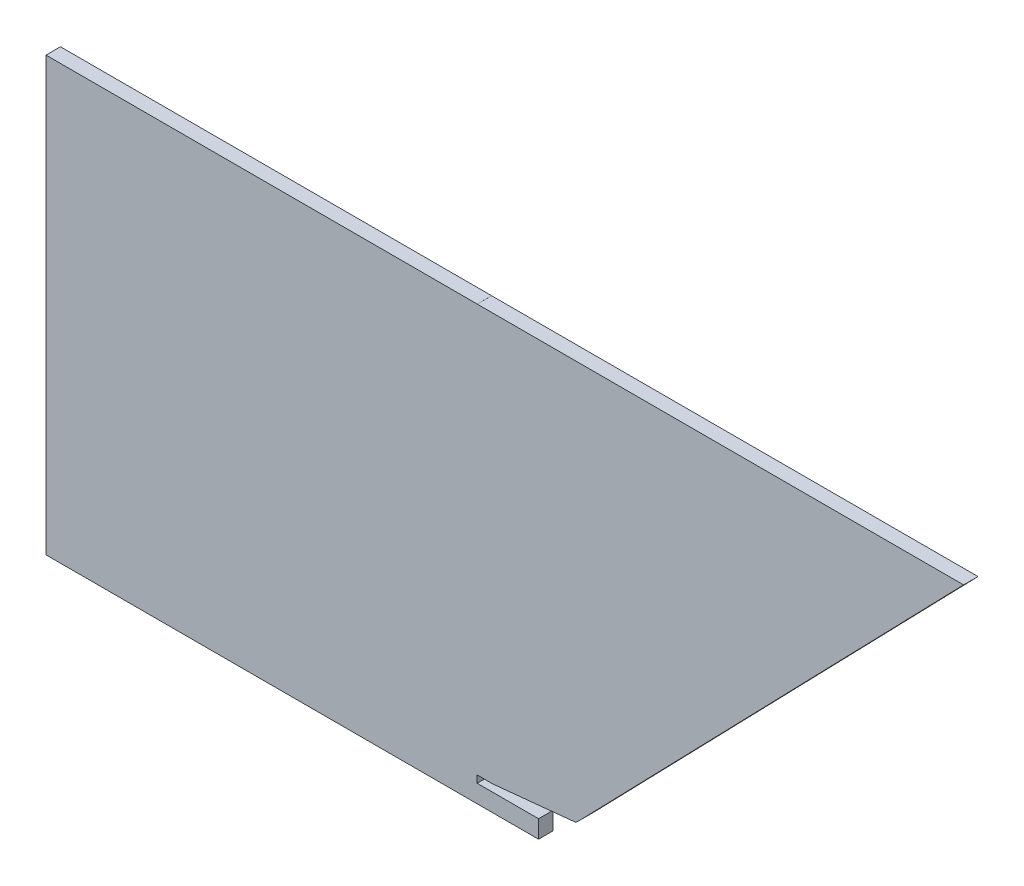
ISO-10303-21;
HEADER;
FILE_DESCRIPTION(('STEP AP214'),'2;1');
FILE_NAME('part.step','',(''),(''),'','','');
FILE_SCHEMA(('AUTOMOTIVE_DESIGN { 1 0 10303 214 1 1 1 1 }'));
ENDSEC;
DATA;
#1=APPLICATION_CONTEXT('core data for automotive mechanical design processes');
#2=APPLICATION_PROTOCOL_DEFINITION('international standard','automotive_design',2000,#1);
#3=PRODUCT_CONTEXT('',#1,'mechanical');
#4=PRODUCT('Part','Part','',(#3));
#5=PRODUCT_RELATED_PRODUCT_CATEGORY('part','',(#4));
#6=PRODUCT_DEFINITION_FORMATION('','',#4);
#7=PRODUCT_DEFINITION_CONTEXT('part definition',#1,'design');
#8=PRODUCT_DEFINITION('design','',#6,#7);
#9=PRODUCT_DEFINITION_SHAPE('','',#8);
#10=(LENGTH_UNIT() NAMED_UNIT(*) SI_UNIT(.MILLI.,.METRE.));
#11=(NAMED_UNIT(*) PLANE_ANGLE_UNIT() SI_UNIT($,.RADIAN.));
#12=(NAMED_UNIT(*) SI_UNIT($,.STERADIAN.) SOLID_ANGLE_UNIT());
#13=UNCERTAINTY_MEASURE_WITH_UNIT(LENGTH_MEASURE(1.E-05),#10,'distance_accuracy_value','');
#14=(GEOMETRIC_REPRESENTATION_CONTEXT(3) GLOBAL_UNCERTAINTY_ASSIGNED_CONTEXT((#13)) GLOBAL_UNIT_ASSIGNED_CONTEXT((#10,
#11,#12)) REPRESENTATION_CONTEXT('',''));
#15=CARTESIAN_POINT('',(0.,0.,0.));
#16=DIRECTION('',(0.,0.,1.));
#17=DIRECTION('',(1.,0.,0.));
#18=AXIS2_PLACEMENT_3D('',#15,#16,#17);
#19=CARTESIAN_POINT('',(0.,29.9956189480923,1.));
#20=DIRECTION('',(0.,-1.,0.));
#21=DIRECTION('',(-1.,0.,0.));
#22=AXIS2_PLACEMENT_3D('',#19,#20,#21);
#23=PLANE('',#22);
#24=DIRECTION('',(-1.,0.,0.));
#25=VECTOR('',#24,1.);
#26=CARTESIAN_POINT('',(0.,29.9956189480923,1.));
#27=LINE('',#26,#25);
#28=CARTESIAN_POINT('',(90.4166488621757,29.9956189480923,0.999999999999994));
#29=VERTEX_POINT('',#28);
#30=CARTESIAN_POINT('',(22.9944465005349,29.9956189480923,1.));
#31=VERTEX_POINT('',#30);
#32=EDGE_CURVE('E215',#29,#31,#27,.T.);
#33=ORIENTED_EDGE('',*,*,#32,.F.);
#34=DIRECTION('',(0.,0.,1.));
#35=VECTOR('',#34,1.);
#36=CARTESIAN_POINT('',(90.4166488621757,29.9956189480923,0.999999999999994));
#37=LINE('',#36,#35);
#38=CARTESIAN_POINT('',(90.4166488621757,29.9956189480923,-0.99999999999999));
#39=VERTEX_POINT('',#38);
#40=EDGE_CURVE('E195',#39,#29,#37,.T.);
#41=ORIENTED_EDGE('',*,*,#40,.F.);
#42=DIRECTION('',(-1.,0.,0.));
#43=VECTOR('',#42,1.);
#44=CARTESIAN_POINT('',(0.,29.9956189480923,-1.));
#45=LINE('',#44,#43);
#46=CARTESIAN_POINT('',(22.9944465005349,29.9956189480923,-1.));
#47=VERTEX_POINT('',#46);
#48=EDGE_CURVE('E241',#39,#47,#45,.T.);
#49=ORIENTED_EDGE('',*,*,#48,.T.);
#50=DIRECTION('',(0.,0.,1.));
#51=VECTOR('',#50,1.);
#52=CARTESIAN_POINT('',(22.9944465005349,29.9956189480923,1.));
#53=LINE('',#52,#51);
#54=EDGE_CURVE('E63',#47,#31,#53,.T.);
#55=ORIENTED_EDGE('',*,*,#54,.T.);
#56=EDGE_LOOP('',(#33,#41,#49,#55));
#57=FACE_BOUND('',#56,.T.);
#58=ADVANCED_FACE('F53',(#57),#23,.F.);
#59=CARTESIAN_POINT('',(22.9944465005349,0.,1.));
#60=DIRECTION('',(-1.,0.,0.));
#61=DIRECTION('',(0.,1.,0.));
#62=AXIS2_PLACEMENT_3D('',#59,#60,#61);
#63=PLANE('',#62);
#64=ORIENTED_EDGE('',*,*,#54,.F.);
#65=DIRECTION('',(0.,1.,0.));
#66=VECTOR('',#65,1.);
#67=CARTESIAN_POINT('',(22.9944465005349,0.,-1.));
#68=LINE('',#67,#66);
#69=CARTESIAN_POINT('',(22.9944465005349,30.,-1.));
#70=VERTEX_POINT('',#69);
#71=EDGE_CURVE('E205',#47,#70,#68,.T.);
#72=ORIENTED_EDGE('',*,*,#71,.T.);
#73=DIRECTION('',(0.,0.,1.));
#74=VECTOR('',#73,1.);
#75=CARTESIAN_POINT('',(22.9944465005349,30.,1.));
#76=LINE('',#75,#74);
#77=CARTESIAN_POINT('',(22.9944465005349,30.,1.));
#78=VERTEX_POINT('',#77);
#79=EDGE_CURVE('E262',#70,#78,#76,.T.);
#80=ORIENTED_EDGE('',*,*,#79,.T.);
#81=DIRECTION('',(0.,1.,0.));
#82=VECTOR('',#81,1.);
#83=CARTESIAN_POINT('',(22.9944465005349,0.,1.));
#84=LINE('',#83,#82);
#85=EDGE_CURVE('E151',#31,#78,#84,.T.);
#86=ORIENTED_EDGE('',*,*,#85,.F.);
#87=EDGE_LOOP('',(#64,#72,#80,#86));
#88=FACE_BOUND('',#87,.T.);
#89=ADVANCED_FACE('F290',(#88),#63,.F.);
#90=CARTESIAN_POINT('',(-31.5,30.,1.));
#91=DIRECTION('',(0.,-1.,0.));
#92=DIRECTION('',(-1.,0.,0.));
#93=AXIS2_PLACEMENT_3D('',#90,#91,#92);
#94=PLANE('',#93);
#95=ORIENTED_EDGE('',*,*,#79,.F.);
#96=DIRECTION('',(-1.,0.,0.));
#97=VECTOR('',#96,1.);
#98=CARTESIAN_POINT('',(0.,30.,-1.));
#99=LINE('',#98,#97);
#100=CARTESIAN_POINT('',(-36.7787595947439,30.,-1.));
#101=VERTEX_POINT('',#100);
#102=EDGE_CURVE('E161',#70,#101,#99,.T.);
#103=ORIENTED_EDGE('',*,*,#102,.T.);
#104=DIRECTION('',(0.,0.,1.));
#105=VECTOR('',#104,1.);
#106=CARTESIAN_POINT('',(-36.7787595947439,30.,0.));
#107=LINE('',#106,#105);
#108=CARTESIAN_POINT('',(-36.7787595947439,30.,1.));
#109=VERTEX_POINT('',#108);
#110=EDGE_CURVE('E158',#101,#109,#107,.T.);
#111=ORIENTED_EDGE('',*,*,#110,.T.);
#112=DIRECTION('',(-1.,0.,0.));
#113=VECTOR('',#112,1.);
#114=CARTESIAN_POINT('',(-31.5,30.,1.));
#115=LINE('',#114,#113);
#116=EDGE_CURVE('E145',#78,#109,#115,.T.);
#117=ORIENTED_EDGE('',*,*,#116,.F.);
#118=EDGE_LOOP('',(#95,#103,#111,#117));
#119=FACE_BOUND('',#118,.T.);
#120=ADVANCED_FACE('F159',(#119),#94,.F.);
#121=CARTESIAN_POINT('',(-31.5,-30.,1.));
#122=DIRECTION('',(0.,1.,0.));
#123=DIRECTION('',(1.,0.,0.));
#124=AXIS2_PLACEMENT_3D('',#121,#122,#123);
#125=PLANE('',#124);
#126=DIRECTION('',(0.,0.,1.));
#127=VECTOR('',#126,1.);
#128=CARTESIAN_POINT('',(31.5,-30.,1.));
#129=LINE('',#128,#127);
#130=CARTESIAN_POINT('',(31.5,-30.,-1.));
#131=VERTEX_POINT('',#130);
#132=CARTESIAN_POINT('',(31.5,-30.,1.));
#133=VERTEX_POINT('',#132);
#134=EDGE_CURVE('E258',#131,#133,#129,.T.);
#135=ORIENTED_EDGE('',*,*,#134,.T.);
#136=DIRECTION('',(1.,0.,0.));
#137=VECTOR('',#136,1.);
#138=CARTESIAN_POINT('',(-31.5,-30.,1.));
#139=LINE('',#138,#137);
#140=CARTESIAN_POINT('',(-36.7787595947439,-30.,1.));
#141=VERTEX_POINT('',#140);
#142=EDGE_CURVE('E154',#141,#133,#139,.T.);
#143=ORIENTED_EDGE('',*,*,#142,.F.);
#144=DIRECTION('',(0.,0.,1.));
#145=VECTOR('',#144,1.);
#146=CARTESIAN_POINT('',(-36.7787595947439,-30.,0.));
#147=LINE('',#146,#145);
#148=CARTESIAN_POINT('',(-36.7787595947439,-30.,-1.));
#149=VERTEX_POINT('',#148);
#150=EDGE_CURVE('E166',#149,#141,#147,.T.);
#151=ORIENTED_EDGE('',*,*,#150,.F.);
#152=DIRECTION('',(-1.,0.,0.));
#153=VECTOR('',#152,1.);
#154=CARTESIAN_POINT('',(0.,-30.,-1.));
#155=LINE('',#154,#153);
#156=EDGE_CURVE('E228',#149,#131,#155,.F.);
#157=ORIENTED_EDGE('',*,*,#156,.T.);
#158=EDGE_LOOP('',(#135,#143,#151,#157));
#159=FACE_BOUND('',#158,.T.);
#160=ADVANCED_FACE('F295',(#159),#125,.F.);
#161=CARTESIAN_POINT('',(31.5,-30.,1.));
#162=DIRECTION('',(-1.,0.,0.));
#163=DIRECTION('',(0.,1.,0.));
#164=AXIS2_PLACEMENT_3D('',#161,#162,#163);
#165=PLANE('',#164);
#166=ORIENTED_EDGE('',*,*,#134,.F.);
#167=DIRECTION('',(0.,1.,0.));
#168=VECTOR('',#167,1.);
#169=CARTESIAN_POINT('',(31.5,0.,-1.));
#170=LINE('',#169,#168);
#171=CARTESIAN_POINT('',(31.5,-27.5343810519077,-1.));
#172=VERTEX_POINT('',#171);
#173=EDGE_CURVE('E229',#131,#172,#170,.T.);
#174=ORIENTED_EDGE('',*,*,#173,.T.);
#175=DIRECTION('',(0.,0.,1.));
#176=VECTOR('',#175,1.);
#177=CARTESIAN_POINT('',(31.5,-27.5343810519077,1.));
#178=LINE('',#177,#176);
#179=CARTESIAN_POINT('',(31.5,-27.5343810519077,1.));
#180=VERTEX_POINT('',#179);
#181=EDGE_CURVE('E255',#172,#180,#178,.T.);
#182=ORIENTED_EDGE('',*,*,#181,.T.);
#183=DIRECTION('',(0.,1.,0.));
#184=VECTOR('',#183,1.);
#185=CARTESIAN_POINT('',(31.5,-30.,1.));
#186=LINE('',#185,#184);
#187=EDGE_CURVE('E155',#133,#180,#186,.T.);
#188=ORIENTED_EDGE('',*,*,#187,.F.);
#189=EDGE_LOOP('',(#166,#174,#182,#188));
#190=FACE_BOUND('',#189,.T.);
#191=ADVANCED_FACE('F307',(#190),#165,.F.);
#192=CARTESIAN_POINT('',(0.,-27.5343810519077,1.));
#193=DIRECTION('',(0.,-1.,0.));
#194=DIRECTION('',(-1.,0.,0.));
#195=AXIS2_PLACEMENT_3D('',#192,#193,#194);
#196=PLANE('',#195);
#197=DIRECTION('',(0.,0.,1.));
#198=VECTOR('',#197,1.);
#199=CARTESIAN_POINT('',(22.9944465005349,-27.5343810519077,1.));
#200=LINE('',#199,#198);
#201=CARTESIAN_POINT('',(22.9944465005349,-27.5343810519077,-1.));
#202=VERTEX_POINT('',#201);
#203=CARTESIAN_POINT('',(22.9944465005349,-27.5343810519077,1.));
#204=VERTEX_POINT('',#203);
#205=EDGE_CURVE('E251',#202,#204,#200,.T.);
#206=ORIENTED_EDGE('',*,*,#205,.T.);
#207=DIRECTION('',(-1.,0.,0.));
#208=VECTOR('',#207,1.);
#209=CARTESIAN_POINT('',(0.,-27.5343810519077,1.));
#210=LINE('',#209,#208);
#211=EDGE_CURVE('E209',#180,#204,#210,.T.);
#212=ORIENTED_EDGE('',*,*,#211,.F.);
#213=ORIENTED_EDGE('',*,*,#181,.F.);
#214=DIRECTION('',(-1.,0.,0.));
#215=VECTOR('',#214,1.);
#216=CARTESIAN_POINT('',(0.,-27.5343810519077,-1.));
#217=LINE('',#216,#215);
#218=EDGE_CURVE('E225',#172,#202,#217,.T.);
#219=ORIENTED_EDGE('',*,*,#218,.T.);
#220=EDGE_LOOP('',(#206,#212,#213,#219));
#221=FACE_BOUND('',#220,.T.);
#222=ADVANCED_FACE('F300',(#221),#196,.F.);
#223=CARTESIAN_POINT('',(22.9944465005349,0.,1.));
#224=DIRECTION('',(-1.,0.,0.));
#225=DIRECTION('',(0.,1.,0.));
#226=AXIS2_PLACEMENT_3D('',#223,#224,#225);
#227=PLANE('',#226);
#228=ORIENTED_EDGE('',*,*,#205,.F.);
#229=DIRECTION('',(0.,1.,0.));
#230=VECTOR('',#229,1.);
#231=CARTESIAN_POINT('',(22.9944465005349,0.,-1.));
#232=LINE('',#231,#230);
#233=CARTESIAN_POINT('',(22.9944465005349,-26.5343810519077,-1.));
#234=VERTEX_POINT('',#233);
#235=EDGE_CURVE('E221',#202,#234,#232,.T.);
#236=ORIENTED_EDGE('',*,*,#235,.T.);
#237=DIRECTION('',(0.,0.,1.));
#238=VECTOR('',#237,1.);
#239=CARTESIAN_POINT('',(22.9944465005349,-26.5343810519077,1.));
#240=LINE('',#239,#238);
#241=CARTESIAN_POINT('',(22.9944465005349,-26.5343810519077,1.));
#242=VERTEX_POINT('',#241);
#243=EDGE_CURVE('E220',#234,#242,#240,.T.);
#244=ORIENTED_EDGE('',*,*,#243,.T.);
#245=DIRECTION('',(0.,1.,0.));
#246=VECTOR('',#245,1.);
#247=CARTESIAN_POINT('',(22.9944465005349,0.,1.));
#248=LINE('',#247,#246);
#249=EDGE_CURVE('E212',#204,#242,#248,.T.);
#250=ORIENTED_EDGE('',*,*,#249,.F.);
#251=EDGE_LOOP('',(#228,#236,#244,#250));
#252=FACE_BOUND('',#251,.T.);
#253=ADVANCED_FACE('F305',(#252),#227,.F.);
#254=CARTESIAN_POINT('',(0.,-26.5343810519077,1.));
#255=DIRECTION('',(0.,1.,0.));
#256=DIRECTION('',(1.,0.,0.));
#257=AXIS2_PLACEMENT_3D('',#254,#255,#256);
#258=PLANE('',#257);
#259=ORIENTED_EDGE('',*,*,#243,.F.);
#260=DIRECTION('',(-1.,0.,0.));
#261=VECTOR('',#260,1.);
#262=CARTESIAN_POINT('',(0.,-26.5343810519077,-1.));
#263=LINE('',#262,#261);
#264=CARTESIAN_POINT('',(25.1491470389141,-26.5343810519077,-1.));
#265=VERTEX_POINT('',#264);
#266=EDGE_CURVE('E69',#234,#265,#263,.F.);
#267=ORIENTED_EDGE('',*,*,#266,.T.);
#268=DIRECTION('',(0.,0.,-1.));
#269=VECTOR('',#268,1.);
#270=CARTESIAN_POINT('',(25.1491470389141,-26.5343810519077,1.));
#271=LINE('',#270,#269);
#272=CARTESIAN_POINT('',(25.1491470389141,-26.5343810519077,1.));
#273=VERTEX_POINT('',#272);
#274=EDGE_CURVE('E12',#265,#273,#271,.F.);
#275=ORIENTED_EDGE('',*,*,#274,.T.);
#276=DIRECTION('',(1.,0.,0.));
#277=VECTOR('',#276,1.);
#278=CARTESIAN_POINT('',(0.,-26.5343810519077,1.));
#279=LINE('',#278,#277);
#280=EDGE_CURVE('E77',#242,#273,#279,.T.);
#281=ORIENTED_EDGE('',*,*,#280,.F.);
#282=EDGE_LOOP('',(#259,#267,#275,#281));
#283=FACE_BOUND('',#282,.T.);
#284=ADVANCED_FACE('F306',(#283),#258,.F.);
#285=CARTESIAN_POINT('',(0.,0.,1.));
#286=DIRECTION('',(0.,0.,-1.));
#287=DIRECTION('',(-1.,0.,0.));
#288=AXIS2_PLACEMENT_3D('',#285,#286,#287);
#289=PLANE('',#288);
#290=ORIENTED_EDGE('',*,*,#211,.T.);
#291=ORIENTED_EDGE('',*,*,#249,.T.);
#292=ORIENTED_EDGE('',*,*,#280,.T.);
#293=DIRECTION('',(0.99511118531748,0.0987609682822092,0.));
#294=VECTOR('',#293,1.);
#295=CARTESIAN_POINT('',(25.1491470389141,-26.5343810519077,1.));
#296=LINE('',#295,#294);
#297=CARTESIAN_POINT('',(36.6683201020767,-25.3911473084689,1.));
#298=VERTEX_POINT('',#297);
#299=EDGE_CURVE('E233',#273,#298,#296,.T.);
#300=ORIENTED_EDGE('',*,*,#299,.T.);
#301=DIRECTION('',(0.718856780035361,0.695158204869361,0.));
#302=VECTOR('',#301,1.);
#303=CARTESIAN_POINT('',(37.9360358134944,-24.1652244227024,1.00000000000001));
#304=LINE('',#303,#302);
#305=CARTESIAN_POINT('',(37.3061124810207,-24.7743810519077,1.));
#306=VERTEX_POINT('',#305);
#307=EDGE_CURVE('E191',#298,#306,#304,.T.);
#308=ORIENTED_EDGE('',*,*,#307,.T.);
#309=DIRECTION('',(0.696147412442573,0.717898864847626,0.));
#310=VECTOR('',#309,1.);
#311=CARTESIAN_POINT('',(38.6678122665794,-23.3701343178922,1.00000000000001));
#312=LINE('',#311,#310);
#313=EDGE_CURVE('E187',#306,#29,#312,.T.);
#314=ORIENTED_EDGE('',*,*,#313,.T.);
#315=ORIENTED_EDGE('',*,*,#32,.T.);
#316=ORIENTED_EDGE('',*,*,#85,.T.);
#317=ORIENTED_EDGE('',*,*,#116,.T.);
#318=DIRECTION('',(0.,1.,0.));
#319=VECTOR('',#318,1.);
#320=CARTESIAN_POINT('',(-36.7787595947439,0.,1.));
#321=LINE('',#320,#319);
#322=EDGE_CURVE('E148',#109,#141,#321,.F.);
#323=ORIENTED_EDGE('',*,*,#322,.T.);
#324=ORIENTED_EDGE('',*,*,#142,.T.);
#325=ORIENTED_EDGE('',*,*,#187,.T.);
#326=EDGE_LOOP('',(#290,#291,#292,#300,#308,#314,#315,#316,#317,#323,#324,#325));
#327=FACE_BOUND('',#326,.T.);
#328=ADVANCED_FACE('F55',(#327),#289,.F.);
#329=CARTESIAN_POINT('',(0.,0.,-1.));
#330=DIRECTION('',(0.,0.,-1.));
#331=DIRECTION('',(-1.,0.,0.));
#332=AXIS2_PLACEMENT_3D('',#329,#330,#331);
#333=PLANE('',#332);
#334=ORIENTED_EDGE('',*,*,#266,.F.);
#335=ORIENTED_EDGE('',*,*,#235,.F.);
#336=ORIENTED_EDGE('',*,*,#218,.F.);
#337=ORIENTED_EDGE('',*,*,#173,.F.);
#338=ORIENTED_EDGE('',*,*,#156,.F.);
#339=DIRECTION('',(0.,1.,0.));
#340=VECTOR('',#339,1.);
#341=CARTESIAN_POINT('',(-36.7787595947439,0.,-1.));
#342=LINE('',#341,#340);
#343=EDGE_CURVE('E172',#101,#149,#342,.F.);
#344=ORIENTED_EDGE('',*,*,#343,.F.);
#345=ORIENTED_EDGE('',*,*,#102,.F.);
#346=ORIENTED_EDGE('',*,*,#71,.F.);
#347=ORIENTED_EDGE('',*,*,#48,.F.);
#348=DIRECTION('',(0.696147412442573,0.717898864847626,0.));
#349=VECTOR('',#348,1.);
#350=CARTESIAN_POINT('',(38.6678122665794,-23.3701343178922,-0.999999999999984));
#351=LINE('',#350,#349);
#352=CARTESIAN_POINT('',(37.3061124810207,-24.7743810519077,-0.99999999999999));
#353=VERTEX_POINT('',#352);
#354=EDGE_CURVE('E199',#353,#39,#351,.T.);
#355=ORIENTED_EDGE('',*,*,#354,.F.);
#356=DIRECTION('',(0.718856780035361,0.695158204869361,0.));
#357=VECTOR('',#356,1.);
#358=CARTESIAN_POINT('',(37.9360358134944,-24.1652244227024,-0.99999999999999));
#359=LINE('',#358,#357);
#360=CARTESIAN_POINT('',(36.6683201020767,-25.3911473084689,-0.999999999999994));
#361=VERTEX_POINT('',#360);
#362=EDGE_CURVE('E183',#361,#353,#359,.T.);
#363=ORIENTED_EDGE('',*,*,#362,.F.);
#364=DIRECTION('',(0.99511118531748,0.0987609682822092,0.));
#365=VECTOR('',#364,1.);
#366=CARTESIAN_POINT('',(25.1491470389141,-26.5343810519077,-1.));
#367=LINE('',#366,#365);
#368=EDGE_CURVE('E182',#265,#361,#367,.T.);
#369=ORIENTED_EDGE('',*,*,#368,.F.);
#370=EDGE_LOOP('',(#334,#335,#336,#337,#338,#344,#345,#346,#347,#355,#363,#369));
#371=FACE_BOUND('',#370,.T.);
#372=ADVANCED_FACE('F285',(#371),#333,.T.);
#373=CARTESIAN_POINT('',(25.1491470389141,-26.5343810519077,0.));
#374=DIRECTION('',(0.0987609682822092,-0.99511118531748,0.));
#375=DIRECTION('',(0.99511118531748,0.0987609682822092,0.));
#376=AXIS2_PLACEMENT_3D('',#373,#374,#375);
#377=PLANE('',#376);
#378=ORIENTED_EDGE('',*,*,#274,.F.);
#379=ORIENTED_EDGE('',*,*,#368,.T.);
#380=DIRECTION('',(0.,0.,1.));
#381=VECTOR('',#380,1.);
#382=CARTESIAN_POINT('',(36.6683201020767,-25.3911473084689,0.));
#383=LINE('',#382,#381);
#384=EDGE_CURVE('E57',#361,#298,#383,.T.);
#385=ORIENTED_EDGE('',*,*,#384,.T.);
#386=ORIENTED_EDGE('',*,*,#299,.F.);
#387=EDGE_LOOP('',(#378,#379,#385,#386));
#388=FACE_BOUND('',#387,.T.);
#389=ADVANCED_FACE('F275',(#388),#377,.T.);
#390=CARTESIAN_POINT('',(38.6678122665794,-23.3701343178922,1.00000000000001));
#391=DIRECTION('',(0.717898864847626,-0.696147412442573,0.));
#392=DIRECTION('',(0.696147412442573,0.717898864847626,0.));
#393=AXIS2_PLACEMENT_3D('',#390,#391,#392);
#394=PLANE('',#393);
#395=DIRECTION('',(0.,0.,1.));
#396=VECTOR('',#395,1.);
#397=CARTESIAN_POINT('',(37.3061124810207,-24.7743810519077,1.));
#398=LINE('',#397,#396);
#399=EDGE_CURVE('E179',#353,#306,#398,.T.);
#400=ORIENTED_EDGE('',*,*,#399,.F.);
#401=ORIENTED_EDGE('',*,*,#354,.T.);
#402=ORIENTED_EDGE('',*,*,#40,.T.);
#403=ORIENTED_EDGE('',*,*,#313,.F.);
#404=EDGE_LOOP('',(#400,#401,#402,#403));
#405=FACE_BOUND('',#404,.T.);
#406=ADVANCED_FACE('F283',(#405),#394,.T.);
#407=CARTESIAN_POINT('',(37.9360358134944,-24.1652244227024,1.00000000000001));
#408=DIRECTION('',(0.695158204869361,-0.718856780035361,0.));
#409=DIRECTION('',(0.718856780035361,0.695158204869361,0.));
#410=AXIS2_PLACEMENT_3D('',#407,#408,#409);
#411=PLANE('',#410);
#412=ORIENTED_EDGE('',*,*,#384,.F.);
#413=ORIENTED_EDGE('',*,*,#362,.T.);
#414=ORIENTED_EDGE('',*,*,#399,.T.);
#415=ORIENTED_EDGE('',*,*,#307,.F.);
#416=EDGE_LOOP('',(#412,#413,#414,#415));
#417=FACE_BOUND('',#416,.T.);
#418=ADVANCED_FACE('F280',(#417),#411,.T.);
#419=CARTESIAN_POINT('',(-36.7787595947439,0.,0.));
#420=DIRECTION('',(1.,0.,0.));
#421=DIRECTION('',(0.,1.,0.));
#422=AXIS2_PLACEMENT_3D('',#419,#420,#421);
#423=PLANE('',#422);
#424=ORIENTED_EDGE('',*,*,#110,.F.);
#425=ORIENTED_EDGE('',*,*,#343,.T.);
#426=ORIENTED_EDGE('',*,*,#150,.T.);
#427=ORIENTED_EDGE('',*,*,#322,.F.);
#428=EDGE_LOOP('',(#424,#425,#426,#427));
#429=FACE_BOUND('',#428,.T.);
#430=ADVANCED_FACE('F169',(#429),#423,.F.);
#431=CLOSED_SHELL('',(#58,#89,#120,#160,#191,#222,#253,#284,#328,#372,#389,#406,#418,#430));
#432=MANIFOLD_SOLID_BREP('B2',#431);
#433=ADVANCED_BREP_SHAPE_REPRESENTATION('',(#18,#432),#14);
#434=SHAPE_DEFINITION_REPRESENTATION(#9,#433);
ENDSEC;
END-ISO-10303-21;
